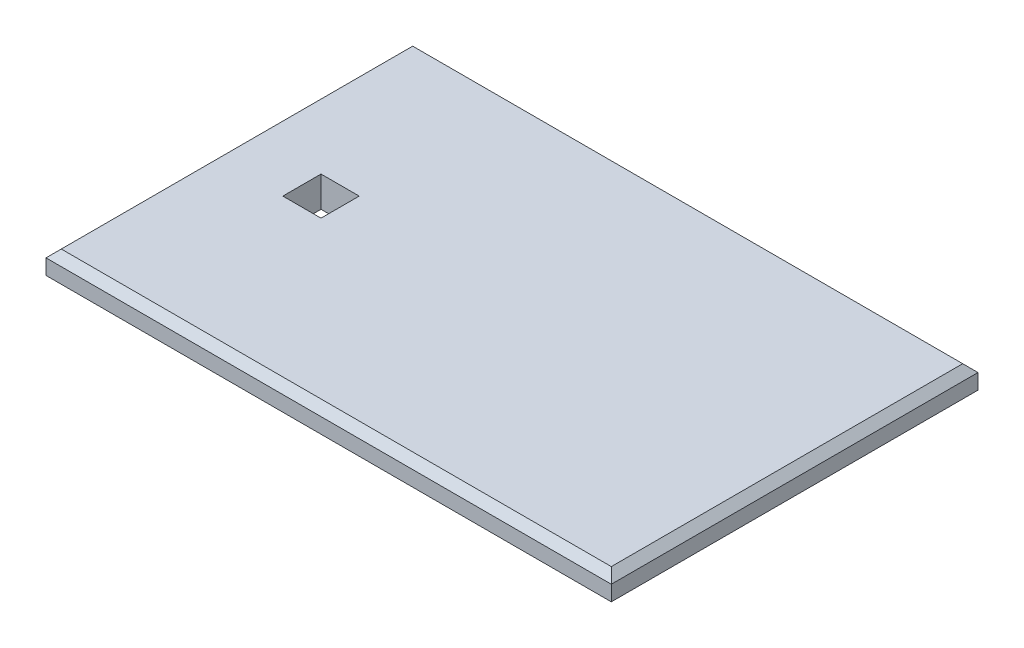
ISO-10303-21;
HEADER;
FILE_DESCRIPTION(('STEP AP214'),'2;1');
FILE_NAME('part.step','',(''),(''),'','','');
FILE_SCHEMA(('AUTOMOTIVE_DESIGN { 1 0 10303 214 1 1 1 1 }'));
ENDSEC;
DATA;
#1=APPLICATION_CONTEXT('core data for automotive mechanical design processes');
#2=APPLICATION_PROTOCOL_DEFINITION('international standard','automotive_design',2000,#1);
#3=PRODUCT_CONTEXT('',#1,'mechanical');
#4=PRODUCT('Part','Part','',(#3));
#5=PRODUCT_RELATED_PRODUCT_CATEGORY('part','',(#4));
#6=PRODUCT_DEFINITION_FORMATION('','',#4);
#7=PRODUCT_DEFINITION_CONTEXT('part definition',#1,'design');
#8=PRODUCT_DEFINITION('design','',#6,#7);
#9=PRODUCT_DEFINITION_SHAPE('','',#8);
#10=(LENGTH_UNIT() NAMED_UNIT(*) SI_UNIT(.MILLI.,.METRE.));
#11=(NAMED_UNIT(*) PLANE_ANGLE_UNIT() SI_UNIT($,.RADIAN.));
#12=(NAMED_UNIT(*) SI_UNIT($,.STERADIAN.) SOLID_ANGLE_UNIT());
#13=UNCERTAINTY_MEASURE_WITH_UNIT(LENGTH_MEASURE(1.E-05),#10,'distance_accuracy_value','');
#14=(GEOMETRIC_REPRESENTATION_CONTEXT(3) GLOBAL_UNCERTAINTY_ASSIGNED_CONTEXT((#13)) GLOBAL_UNIT_ASSIGNED_CONTEXT((#10,
#11,#12)) REPRESENTATION_CONTEXT('',''));
#15=CARTESIAN_POINT('',(0.,0.,0.));
#16=DIRECTION('',(0.,0.,1.));
#17=DIRECTION('',(1.,0.,0.));
#18=AXIS2_PLACEMENT_3D('',#15,#16,#17);
#19=CARTESIAN_POINT('',(37.,3.,0.));
#20=DIRECTION('',(-1.,0.,0.));
#21=DIRECTION('',(0.,0.,1.));
#22=AXIS2_PLACEMENT_3D('',#19,#20,#21);
#23=PLANE('',#22);
#24=DIRECTION('',(0.,-1.,0.));
#25=VECTOR('',#24,1.);
#26=CARTESIAN_POINT('',(37.,3.,-24.));
#27=LINE('',#26,#25);
#28=CARTESIAN_POINT('',(37.,1.99999999999999,-24.));
#29=VERTEX_POINT('',#28);
#30=CARTESIAN_POINT('',(37.,0.,-24.));
#31=VERTEX_POINT('',#30);
#32=EDGE_CURVE('E300',#29,#31,#27,.T.);
#33=ORIENTED_EDGE('',*,*,#32,.F.);
#34=DIRECTION('',(0.,0.,1.));
#35=VECTOR('',#34,1.);
#36=CARTESIAN_POINT('',(37.,1.99999999999999,24.));
#37=LINE('',#36,#35);
#38=CARTESIAN_POINT('',(37.,1.99999999999999,24.));
#39=VERTEX_POINT('',#38);
#40=EDGE_CURVE('E325',#29,#39,#37,.T.);
#41=ORIENTED_EDGE('',*,*,#40,.T.);
#42=DIRECTION('',(0.,-1.,0.));
#43=VECTOR('',#42,1.);
#44=CARTESIAN_POINT('',(37.,3.,24.));
#45=LINE('',#44,#43);
#46=CARTESIAN_POINT('',(37.,0.,24.));
#47=VERTEX_POINT('',#46);
#48=EDGE_CURVE('E297',#39,#47,#45,.T.);
#49=ORIENTED_EDGE('',*,*,#48,.T.);
#50=DIRECTION('',(0.,0.,-1.));
#51=VECTOR('',#50,1.);
#52=CARTESIAN_POINT('',(37.,0.,0.));
#53=LINE('',#52,#51);
#54=EDGE_CURVE('E283',#47,#31,#53,.T.);
#55=ORIENTED_EDGE('',*,*,#54,.T.);
#56=EDGE_LOOP('',(#33,#41,#49,#55));
#57=FACE_BOUND('',#56,.T.);
#58=ADVANCED_FACE('F113',(#57),#23,.F.);
#59=CARTESIAN_POINT('',(0.,3.,-24.));
#60=DIRECTION('',(0.,0.,-1.));
#61=DIRECTION('',(-1.,0.,0.));
#62=AXIS2_PLACEMENT_3D('',#59,#60,#61);
#63=PLANE('',#62);
#64=DIRECTION('',(0.,-1.,0.));
#65=VECTOR('',#64,1.);
#66=CARTESIAN_POINT('',(-37.,3.,-24.));
#67=LINE('',#66,#65);
#68=CARTESIAN_POINT('',(-37.,1.99999999999999,-24.));
#69=VERTEX_POINT('',#68);
#70=CARTESIAN_POINT('',(-37.,0.,-24.));
#71=VERTEX_POINT('',#70);
#72=EDGE_CURVE('E299',#69,#71,#67,.T.);
#73=ORIENTED_EDGE('',*,*,#72,.F.);
#74=DIRECTION('',(1.,0.,0.));
#75=VECTOR('',#74,1.);
#76=CARTESIAN_POINT('',(0.,1.99999999999999,-24.));
#77=LINE('',#76,#75);
#78=EDGE_CURVE('E324',#69,#29,#77,.T.);
#79=ORIENTED_EDGE('',*,*,#78,.T.);
#80=ORIENTED_EDGE('',*,*,#32,.T.);
#81=DIRECTION('',(1.,0.,0.));
#82=VECTOR('',#81,1.);
#83=CARTESIAN_POINT('',(0.,0.,-24.));
#84=LINE('',#83,#82);
#85=EDGE_CURVE('E287',#71,#31,#84,.T.);
#86=ORIENTED_EDGE('',*,*,#85,.F.);
#87=EDGE_LOOP('',(#73,#79,#80,#86));
#88=FACE_BOUND('',#87,.T.);
#89=ADVANCED_FACE('F349',(#88),#63,.T.);
#90=CARTESIAN_POINT('',(-37.,3.,0.));
#91=DIRECTION('',(-1.,0.,0.));
#92=DIRECTION('',(0.,0.,1.));
#93=AXIS2_PLACEMENT_3D('',#90,#91,#92);
#94=PLANE('',#93);
#95=DIRECTION('',(0.,-1.,0.));
#96=VECTOR('',#95,1.);
#97=CARTESIAN_POINT('',(-37.,3.,24.));
#98=LINE('',#97,#96);
#99=CARTESIAN_POINT('',(-37.,1.99999999999999,24.));
#100=VERTEX_POINT('',#99);
#101=CARTESIAN_POINT('',(-37.,0.,24.));
#102=VERTEX_POINT('',#101);
#103=EDGE_CURVE('E294',#100,#102,#98,.T.);
#104=ORIENTED_EDGE('',*,*,#103,.F.);
#105=DIRECTION('',(0.,0.,-1.));
#106=VECTOR('',#105,1.);
#107=CARTESIAN_POINT('',(-37.,1.99999999999999,0.));
#108=LINE('',#107,#106);
#109=EDGE_CURVE('E124',#100,#69,#108,.T.);
#110=ORIENTED_EDGE('',*,*,#109,.T.);
#111=ORIENTED_EDGE('',*,*,#72,.T.);
#112=DIRECTION('',(0.,0.,-1.));
#113=VECTOR('',#112,1.);
#114=CARTESIAN_POINT('',(-37.,0.,0.));
#115=LINE('',#114,#113);
#116=EDGE_CURVE('E292',#102,#71,#115,.T.);
#117=ORIENTED_EDGE('',*,*,#116,.F.);
#118=EDGE_LOOP('',(#104,#110,#111,#117));
#119=FACE_BOUND('',#118,.T.);
#120=ADVANCED_FACE('F383',(#119),#94,.T.);
#121=CARTESIAN_POINT('',(0.,3.,24.));
#122=DIRECTION('',(0.,0.,-1.));
#123=DIRECTION('',(-1.,0.,0.));
#124=AXIS2_PLACEMENT_3D('',#121,#122,#123);
#125=PLANE('',#124);
#126=ORIENTED_EDGE('',*,*,#48,.F.);
#127=DIRECTION('',(-1.,0.,0.));
#128=VECTOR('',#127,1.);
#129=CARTESIAN_POINT('',(-37.,1.99999999999999,24.));
#130=LINE('',#129,#128);
#131=EDGE_CURVE('E12',#39,#100,#130,.T.);
#132=ORIENTED_EDGE('',*,*,#131,.T.);
#133=ORIENTED_EDGE('',*,*,#103,.T.);
#134=DIRECTION('',(1.,0.,0.));
#135=VECTOR('',#134,1.);
#136=CARTESIAN_POINT('',(0.,0.,24.));
#137=LINE('',#136,#135);
#138=EDGE_CURVE('E284',#102,#47,#137,.T.);
#139=ORIENTED_EDGE('',*,*,#138,.T.);
#140=EDGE_LOOP('',(#126,#132,#133,#139));
#141=FACE_BOUND('',#140,.T.);
#142=ADVANCED_FACE('F390',(#141),#125,.F.);
#143=CARTESIAN_POINT('',(0.,0.,0.));
#144=DIRECTION('',(0.,1.,0.));
#145=DIRECTION('',(0.,0.,1.));
#146=AXIS2_PLACEMENT_3D('',#143,#144,#145);
#147=PLANE('',#146);
#148=DIRECTION('',(0.,0.,-1.));
#149=VECTOR('',#148,1.);
#150=CARTESIAN_POINT('',(-35.7,0.,0.));
#151=LINE('',#150,#149);
#152=CARTESIAN_POINT('',(-35.7,0.,22.7));
#153=VERTEX_POINT('',#152);
#154=CARTESIAN_POINT('',(-35.7,0.,-22.7));
#155=VERTEX_POINT('',#154);
#156=EDGE_CURVE('E241',#153,#155,#151,.T.);
#157=ORIENTED_EDGE('',*,*,#156,.F.);
#158=DIRECTION('',(1.,0.,0.));
#159=VECTOR('',#158,1.);
#160=CARTESIAN_POINT('',(0.,0.,22.7));
#161=LINE('',#160,#159);
#162=CARTESIAN_POINT('',(35.7,0.,22.7));
#163=VERTEX_POINT('',#162);
#164=EDGE_CURVE('E263',#153,#163,#161,.T.);
#165=ORIENTED_EDGE('',*,*,#164,.T.);
#166=DIRECTION('',(0.,0.,-1.));
#167=VECTOR('',#166,1.);
#168=CARTESIAN_POINT('',(35.7,0.,0.));
#169=LINE('',#168,#167);
#170=CARTESIAN_POINT('',(35.7,0.,-22.7));
#171=VERTEX_POINT('',#170);
#172=EDGE_CURVE('E264',#163,#171,#169,.T.);
#173=ORIENTED_EDGE('',*,*,#172,.T.);
#174=DIRECTION('',(1.,0.,0.));
#175=VECTOR('',#174,1.);
#176=CARTESIAN_POINT('',(0.,0.,-22.7));
#177=LINE('',#176,#175);
#178=EDGE_CURVE('E242',#155,#171,#177,.T.);
#179=ORIENTED_EDGE('',*,*,#178,.F.);
#180=EDGE_LOOP('',(#157,#165,#173,#179));
#181=FACE_BOUND('',#180,.T.);
#182=ORIENTED_EDGE('',*,*,#138,.F.);
#183=ORIENTED_EDGE('',*,*,#116,.T.);
#184=ORIENTED_EDGE('',*,*,#85,.T.);
#185=ORIENTED_EDGE('',*,*,#54,.F.);
#186=EDGE_LOOP('',(#182,#183,#184,#185));
#187=FACE_BOUND('',#186,.T.);
#188=ADVANCED_FACE('F363',(#181,#187),#147,.F.);
#189=CARTESIAN_POINT('',(0.,3.,0.));
#190=DIRECTION('',(0.,1.,0.));
#191=DIRECTION('',(0.,0.,1.));
#192=AXIS2_PLACEMENT_3D('',#189,#190,#191);
#193=PLANE('',#192);
#194=DIRECTION('',(1.,0.,0.));
#195=VECTOR('',#194,1.);
#196=CARTESIAN_POINT('',(37.,3.,23.));
#197=LINE('',#196,#195);
#198=CARTESIAN_POINT('',(-36.,3.,23.));
#199=VERTEX_POINT('',#198);
#200=CARTESIAN_POINT('',(36.,3.,23.));
#201=VERTEX_POINT('',#200);
#202=EDGE_CURVE('E305',#199,#201,#197,.T.);
#203=ORIENTED_EDGE('',*,*,#202,.T.);
#204=DIRECTION('',(0.,0.,-1.));
#205=VECTOR('',#204,1.);
#206=CARTESIAN_POINT('',(36.,3.,-24.));
#207=LINE('',#206,#205);
#208=CARTESIAN_POINT('',(36.,3.,-23.));
#209=VERTEX_POINT('',#208);
#210=EDGE_CURVE('E317',#201,#209,#207,.T.);
#211=ORIENTED_EDGE('',*,*,#210,.T.);
#212=DIRECTION('',(-1.,0.,0.));
#213=VECTOR('',#212,1.);
#214=CARTESIAN_POINT('',(0.,3.,-23.));
#215=LINE('',#214,#213);
#216=CARTESIAN_POINT('',(-36.,3.,-23.));
#217=VERTEX_POINT('',#216);
#218=EDGE_CURVE('E320',#209,#217,#215,.T.);
#219=ORIENTED_EDGE('',*,*,#218,.T.);
#220=DIRECTION('',(0.,0.,1.));
#221=VECTOR('',#220,1.);
#222=CARTESIAN_POINT('',(-36.,3.,0.));
#223=LINE('',#222,#221);
#224=EDGE_CURVE('E312',#217,#199,#223,.T.);
#225=ORIENTED_EDGE('',*,*,#224,.T.);
#226=EDGE_LOOP('',(#203,#211,#219,#225));
#227=FACE_BOUND('',#226,.T.);
#228=DIRECTION('',(1.,0.,0.));
#229=VECTOR('',#228,1.);
#230=CARTESIAN_POINT('',(-27.5,3.,-2.5));
#231=LINE('',#230,#229);
#232=CARTESIAN_POINT('',(-27.5,3.,-2.5));
#233=VERTEX_POINT('',#232);
#234=CARTESIAN_POINT('',(-22.5,3.,-2.5));
#235=VERTEX_POINT('',#234);
#236=EDGE_CURVE('E275',#233,#235,#231,.T.);
#237=ORIENTED_EDGE('',*,*,#236,.T.);
#238=DIRECTION('',(0.,0.,-1.));
#239=VECTOR('',#238,1.);
#240=CARTESIAN_POINT('',(-22.5,3.,2.5));
#241=LINE('',#240,#239);
#242=CARTESIAN_POINT('',(-22.5,3.,2.5));
#243=VERTEX_POINT('',#242);
#244=EDGE_CURVE('E304',#243,#235,#241,.T.);
#245=ORIENTED_EDGE('',*,*,#244,.F.);
#246=DIRECTION('',(1.,0.,0.));
#247=VECTOR('',#246,1.);
#248=CARTESIAN_POINT('',(-27.5,3.,2.5));
#249=LINE('',#248,#247);
#250=CARTESIAN_POINT('',(-27.5,3.,2.5));
#251=VERTEX_POINT('',#250);
#252=EDGE_CURVE('E224',#251,#243,#249,.T.);
#253=ORIENTED_EDGE('',*,*,#252,.F.);
#254=DIRECTION('',(0.,0.,-1.));
#255=VECTOR('',#254,1.);
#256=CARTESIAN_POINT('',(-27.5,3.,2.5));
#257=LINE('',#256,#255);
#258=EDGE_CURVE('E306',#251,#233,#257,.T.);
#259=ORIENTED_EDGE('',*,*,#258,.T.);
#260=EDGE_LOOP('',(#237,#245,#253,#259));
#261=FACE_BOUND('',#260,.T.);
#262=ADVANCED_FACE('F357',(#227,#261),#193,.T.);
#263=CARTESIAN_POINT('',(-27.5,3.,2.5));
#264=DIRECTION('',(0.,0.,-1.));
#265=DIRECTION('',(-1.,0.,0.));
#266=AXIS2_PLACEMENT_3D('',#263,#264,#265);
#267=PLANE('',#266);
#268=DIRECTION('',(0.,-1.,0.));
#269=VECTOR('',#268,1.);
#270=CARTESIAN_POINT('',(-22.5,3.,2.5));
#271=LINE('',#270,#269);
#272=CARTESIAN_POINT('',(-22.5,-1.,2.5));
#273=VERTEX_POINT('',#272);
#274=EDGE_CURVE('E220',#243,#273,#271,.T.);
#275=ORIENTED_EDGE('',*,*,#274,.T.);
#276=DIRECTION('',(1.,0.,0.));
#277=VECTOR('',#276,1.);
#278=CARTESIAN_POINT('',(0.,-1.,2.5));
#279=LINE('',#278,#277);
#280=CARTESIAN_POINT('',(-27.5,-1.,2.5));
#281=VERTEX_POINT('',#280);
#282=EDGE_CURVE('E219',#281,#273,#279,.T.);
#283=ORIENTED_EDGE('',*,*,#282,.F.);
#284=DIRECTION('',(0.,-1.,0.));
#285=VECTOR('',#284,1.);
#286=CARTESIAN_POINT('',(-27.5,3.,2.5));
#287=LINE('',#286,#285);
#288=EDGE_CURVE('E226',#251,#281,#287,.T.);
#289=ORIENTED_EDGE('',*,*,#288,.F.);
#290=ORIENTED_EDGE('',*,*,#252,.T.);
#291=EDGE_LOOP('',(#275,#283,#289,#290));
#292=FACE_BOUND('',#291,.T.);
#293=ADVANCED_FACE('F218',(#292),#267,.T.);
#294=CARTESIAN_POINT('',(-27.5,3.,2.5));
#295=DIRECTION('',(-1.,0.,0.));
#296=DIRECTION('',(0.,0.,1.));
#297=AXIS2_PLACEMENT_3D('',#294,#295,#296);
#298=PLANE('',#297);
#299=ORIENTED_EDGE('',*,*,#288,.T.);
#300=DIRECTION('',(0.,0.,-1.));
#301=VECTOR('',#300,1.);
#302=CARTESIAN_POINT('',(-27.5,-1.,0.));
#303=LINE('',#302,#301);
#304=CARTESIAN_POINT('',(-27.5,-1.,-2.5));
#305=VERTEX_POINT('',#304);
#306=EDGE_CURVE('E236',#281,#305,#303,.T.);
#307=ORIENTED_EDGE('',*,*,#306,.T.);
#308=DIRECTION('',(0.,-1.,0.));
#309=VECTOR('',#308,1.);
#310=CARTESIAN_POINT('',(-27.5,3.,-2.5));
#311=LINE('',#310,#309);
#312=EDGE_CURVE('E282',#233,#305,#311,.T.);
#313=ORIENTED_EDGE('',*,*,#312,.F.);
#314=ORIENTED_EDGE('',*,*,#258,.F.);
#315=EDGE_LOOP('',(#299,#307,#313,#314));
#316=FACE_BOUND('',#315,.T.);
#317=ADVANCED_FACE('F366',(#316),#298,.F.);
#318=CARTESIAN_POINT('',(-27.5,3.,-2.5));
#319=DIRECTION('',(0.,0.,-1.));
#320=DIRECTION('',(-1.,0.,0.));
#321=AXIS2_PLACEMENT_3D('',#318,#319,#320);
#322=PLANE('',#321);
#323=ORIENTED_EDGE('',*,*,#312,.T.);
#324=DIRECTION('',(1.,0.,0.));
#325=VECTOR('',#324,1.);
#326=CARTESIAN_POINT('',(0.,-1.,-2.5));
#327=LINE('',#326,#325);
#328=CARTESIAN_POINT('',(-22.5,-1.,-2.5));
#329=VERTEX_POINT('',#328);
#330=EDGE_CURVE('E248',#305,#329,#327,.T.);
#331=ORIENTED_EDGE('',*,*,#330,.T.);
#332=DIRECTION('',(0.,-1.,0.));
#333=VECTOR('',#332,1.);
#334=CARTESIAN_POINT('',(-22.5,3.,-2.5));
#335=LINE('',#334,#333);
#336=EDGE_CURVE('E230',#235,#329,#335,.T.);
#337=ORIENTED_EDGE('',*,*,#336,.F.);
#338=ORIENTED_EDGE('',*,*,#236,.F.);
#339=EDGE_LOOP('',(#323,#331,#337,#338));
#340=FACE_BOUND('',#339,.T.);
#341=ADVANCED_FACE('F368',(#340),#322,.F.);
#342=CARTESIAN_POINT('',(-22.5,3.,2.5));
#343=DIRECTION('',(-1.,0.,0.));
#344=DIRECTION('',(0.,0.,1.));
#345=AXIS2_PLACEMENT_3D('',#342,#343,#344);
#346=PLANE('',#345);
#347=ORIENTED_EDGE('',*,*,#336,.T.);
#348=DIRECTION('',(0.,0.,-1.));
#349=VECTOR('',#348,1.);
#350=CARTESIAN_POINT('',(-22.5,-1.,0.));
#351=LINE('',#350,#349);
#352=EDGE_CURVE('E234',#273,#329,#351,.T.);
#353=ORIENTED_EDGE('',*,*,#352,.F.);
#354=ORIENTED_EDGE('',*,*,#274,.F.);
#355=ORIENTED_EDGE('',*,*,#244,.T.);
#356=EDGE_LOOP('',(#347,#353,#354,#355));
#357=FACE_BOUND('',#356,.T.);
#358=ADVANCED_FACE('F238',(#357),#346,.T.);
#359=CARTESIAN_POINT('',(0.,-1.,22.7));
#360=DIRECTION('',(0.,0.,1.));
#361=DIRECTION('',(1.,0.,0.));
#362=AXIS2_PLACEMENT_3D('',#359,#360,#361);
#363=PLANE('',#362);
#364=ORIENTED_EDGE('',*,*,#164,.F.);
#365=DIRECTION('',(0.,1.,0.));
#366=VECTOR('',#365,1.);
#367=CARTESIAN_POINT('',(-35.7,-1.,22.7));
#368=LINE('',#367,#366);
#369=CARTESIAN_POINT('',(-35.7,-1.,22.7));
#370=VERTEX_POINT('',#369);
#371=EDGE_CURVE('E267',#370,#153,#368,.T.);
#372=ORIENTED_EDGE('',*,*,#371,.F.);
#373=DIRECTION('',(1.,0.,0.));
#374=VECTOR('',#373,1.);
#375=CARTESIAN_POINT('',(0.,-1.,22.7));
#376=LINE('',#375,#374);
#377=CARTESIAN_POINT('',(35.7,-1.,22.7));
#378=VERTEX_POINT('',#377);
#379=EDGE_CURVE('E253',#370,#378,#376,.T.);
#380=ORIENTED_EDGE('',*,*,#379,.T.);
#381=DIRECTION('',(0.,1.,0.));
#382=VECTOR('',#381,1.);
#383=CARTESIAN_POINT('',(35.7,-1.,22.7));
#384=LINE('',#383,#382);
#385=EDGE_CURVE('E265',#378,#163,#384,.T.);
#386=ORIENTED_EDGE('',*,*,#385,.T.);
#387=EDGE_LOOP('',(#364,#372,#380,#386));
#388=FACE_BOUND('',#387,.T.);
#389=ADVANCED_FACE('F402',(#388),#363,.T.);
#390=CARTESIAN_POINT('',(-35.7,-1.,0.));
#391=DIRECTION('',(1.,0.,0.));
#392=DIRECTION('',(0.,0.,-1.));
#393=AXIS2_PLACEMENT_3D('',#390,#391,#392);
#394=PLANE('',#393);
#395=ORIENTED_EDGE('',*,*,#156,.T.);
#396=DIRECTION('',(0.,1.,0.));
#397=VECTOR('',#396,1.);
#398=CARTESIAN_POINT('',(-35.7,-1.,-22.7));
#399=LINE('',#398,#397);
#400=CARTESIAN_POINT('',(-35.7,-1.,-22.7));
#401=VERTEX_POINT('',#400);
#402=EDGE_CURVE('E272',#401,#155,#399,.T.);
#403=ORIENTED_EDGE('',*,*,#402,.F.);
#404=DIRECTION('',(0.,0.,-1.));
#405=VECTOR('',#404,1.);
#406=CARTESIAN_POINT('',(-35.7,-1.,0.));
#407=LINE('',#406,#405);
#408=EDGE_CURVE('E259',#370,#401,#407,.T.);
#409=ORIENTED_EDGE('',*,*,#408,.F.);
#410=ORIENTED_EDGE('',*,*,#371,.T.);
#411=EDGE_LOOP('',(#395,#403,#409,#410));
#412=FACE_BOUND('',#411,.T.);
#413=ADVANCED_FACE('F404',(#412),#394,.F.);
#414=CARTESIAN_POINT('',(0.,-1.,-22.7));
#415=DIRECTION('',(0.,0.,1.));
#416=DIRECTION('',(1.,0.,0.));
#417=AXIS2_PLACEMENT_3D('',#414,#415,#416);
#418=PLANE('',#417);
#419=ORIENTED_EDGE('',*,*,#178,.T.);
#420=DIRECTION('',(0.,1.,0.));
#421=VECTOR('',#420,1.);
#422=CARTESIAN_POINT('',(35.7,-1.,-22.7));
#423=LINE('',#422,#421);
#424=CARTESIAN_POINT('',(35.7,-1.,-22.7));
#425=VERTEX_POINT('',#424);
#426=EDGE_CURVE('E277',#425,#171,#423,.T.);
#427=ORIENTED_EDGE('',*,*,#426,.F.);
#428=DIRECTION('',(1.,0.,0.));
#429=VECTOR('',#428,1.);
#430=CARTESIAN_POINT('',(0.,-1.,-22.7));
#431=LINE('',#430,#429);
#432=EDGE_CURVE('E260',#401,#425,#431,.T.);
#433=ORIENTED_EDGE('',*,*,#432,.F.);
#434=ORIENTED_EDGE('',*,*,#402,.T.);
#435=EDGE_LOOP('',(#419,#427,#433,#434));
#436=FACE_BOUND('',#435,.T.);
#437=ADVANCED_FACE('F408',(#436),#418,.F.);
#438=CARTESIAN_POINT('',(35.7,-1.,0.));
#439=DIRECTION('',(1.,0.,0.));
#440=DIRECTION('',(0.,0.,-1.));
#441=AXIS2_PLACEMENT_3D('',#438,#439,#440);
#442=PLANE('',#441);
#443=ORIENTED_EDGE('',*,*,#172,.F.);
#444=ORIENTED_EDGE('',*,*,#385,.F.);
#445=DIRECTION('',(0.,0.,-1.));
#446=VECTOR('',#445,1.);
#447=CARTESIAN_POINT('',(35.7,-1.,0.));
#448=LINE('',#447,#446);
#449=EDGE_CURVE('E255',#378,#425,#448,.T.);
#450=ORIENTED_EDGE('',*,*,#449,.T.);
#451=ORIENTED_EDGE('',*,*,#426,.T.);
#452=EDGE_LOOP('',(#443,#444,#450,#451));
#453=FACE_BOUND('',#452,.T.);
#454=ADVANCED_FACE('F409',(#453),#442,.T.);
#455=CARTESIAN_POINT('',(0.,-1.,0.));
#456=DIRECTION('',(0.,1.,0.));
#457=DIRECTION('',(0.,0.,1.));
#458=AXIS2_PLACEMENT_3D('',#455,#456,#457);
#459=PLANE('',#458);
#460=ORIENTED_EDGE('',*,*,#352,.T.);
#461=ORIENTED_EDGE('',*,*,#330,.F.);
#462=ORIENTED_EDGE('',*,*,#306,.F.);
#463=ORIENTED_EDGE('',*,*,#282,.T.);
#464=EDGE_LOOP('',(#460,#461,#462,#463));
#465=FACE_BOUND('',#464,.T.);
#466=ORIENTED_EDGE('',*,*,#379,.F.);
#467=ORIENTED_EDGE('',*,*,#408,.T.);
#468=ORIENTED_EDGE('',*,*,#432,.T.);
#469=ORIENTED_EDGE('',*,*,#449,.F.);
#470=EDGE_LOOP('',(#466,#467,#468,#469));
#471=FACE_BOUND('',#470,.T.);
#472=ADVANCED_FACE('F235',(#465,#471),#459,.F.);
#473=CARTESIAN_POINT('',(-37.,1.99999999999999,0.));
#474=DIRECTION('',(0.70710678118655,-0.707106781186545,0.));
#475=DIRECTION('',(0.,0.,-1.));
#476=AXIS2_PLACEMENT_3D('',#473,#474,#475);
#477=PLANE('',#476);
#478=DIRECTION('',(-0.577350269189624,-0.577350269189628,-0.577350269189624));
#479=VECTOR('',#478,1.);
#480=CARTESIAN_POINT('',(-29.,10.,-16.));
#481=LINE('',#480,#479);
#482=EDGE_CURVE('E332',#69,#217,#481,.F.);
#483=ORIENTED_EDGE('',*,*,#482,.F.);
#484=ORIENTED_EDGE('',*,*,#109,.F.);
#485=DIRECTION('',(0.577350269189624,0.577350269189628,-0.577350269189624));
#486=VECTOR('',#485,1.);
#487=CARTESIAN_POINT('',(-24.0000000000001,15.,11.0000000000001));
#488=LINE('',#487,#486);
#489=EDGE_CURVE('E117',#199,#100,#488,.F.);
#490=ORIENTED_EDGE('',*,*,#489,.F.);
#491=ORIENTED_EDGE('',*,*,#224,.F.);
#492=EDGE_LOOP('',(#483,#484,#490,#491));
#493=FACE_BOUND('',#492,.T.);
#494=ADVANCED_FACE('F120',(#493),#477,.F.);
#495=CARTESIAN_POINT('',(0.,3.,23.));
#496=DIRECTION('',(0.,0.707106781186545,0.70710678118655));
#497=DIRECTION('',(-1.,0.,0.));
#498=AXIS2_PLACEMENT_3D('',#495,#496,#497);
#499=PLANE('',#498);
#500=ORIENTED_EDGE('',*,*,#489,.T.);
#501=ORIENTED_EDGE('',*,*,#131,.F.);
#502=DIRECTION('',(-0.577350269189624,0.577350269189628,-0.577350269189624));
#503=VECTOR('',#502,1.);
#504=CARTESIAN_POINT('',(24.0000000000001,15.,11.0000000000001));
#505=LINE('',#504,#503);
#506=EDGE_CURVE('E329',#201,#39,#505,.F.);
#507=ORIENTED_EDGE('',*,*,#506,.F.);
#508=ORIENTED_EDGE('',*,*,#202,.F.);
#509=EDGE_LOOP('',(#500,#501,#507,#508));
#510=FACE_BOUND('',#509,.T.);
#511=ADVANCED_FACE('F341',(#510),#499,.T.);
#512=CARTESIAN_POINT('',(0.,1.99999999999999,-24.));
#513=DIRECTION('',(0.,-0.707106781186545,0.70710678118655));
#514=DIRECTION('',(1.,0.,0.));
#515=AXIS2_PLACEMENT_3D('',#512,#513,#514);
#516=PLANE('',#515);
#517=ORIENTED_EDGE('',*,*,#482,.T.);
#518=ORIENTED_EDGE('',*,*,#218,.F.);
#519=DIRECTION('',(-0.577350269189624,0.577350269189628,0.577350269189624));
#520=VECTOR('',#519,1.);
#521=CARTESIAN_POINT('',(24.6666666666667,14.3333333333333,-11.6666666666667));
#522=LINE('',#521,#520);
#523=EDGE_CURVE('E327',#29,#209,#522,.T.);
#524=ORIENTED_EDGE('',*,*,#523,.F.);
#525=ORIENTED_EDGE('',*,*,#78,.F.);
#526=EDGE_LOOP('',(#517,#518,#524,#525));
#527=FACE_BOUND('',#526,.T.);
#528=ADVANCED_FACE('F347',(#527),#516,.F.);
#529=CARTESIAN_POINT('',(36.,3.,0.));
#530=DIRECTION('',(0.70710678118655,0.707106781186545,0.));
#531=DIRECTION('',(0.,0.,1.));
#532=AXIS2_PLACEMENT_3D('',#529,#530,#531);
#533=PLANE('',#532);
#534=ORIENTED_EDGE('',*,*,#506,.T.);
#535=ORIENTED_EDGE('',*,*,#40,.F.);
#536=ORIENTED_EDGE('',*,*,#523,.T.);
#537=ORIENTED_EDGE('',*,*,#210,.F.);
#538=EDGE_LOOP('',(#534,#535,#536,#537));
#539=FACE_BOUND('',#538,.T.);
#540=ADVANCED_FACE('F352',(#539),#533,.T.);
#541=CLOSED_SHELL('',(#58,#89,#120,#142,#188,#262,#293,#317,#341,#358,#389,#413,#437,#454,#472,
#494,#511,#528,#540));
#542=MANIFOLD_SOLID_BREP('B2',#541);
#543=ADVANCED_BREP_SHAPE_REPRESENTATION('',(#18,#542),#14);
#544=SHAPE_DEFINITION_REPRESENTATION(#9,#543);
ENDSEC;
END-ISO-10303-21;
